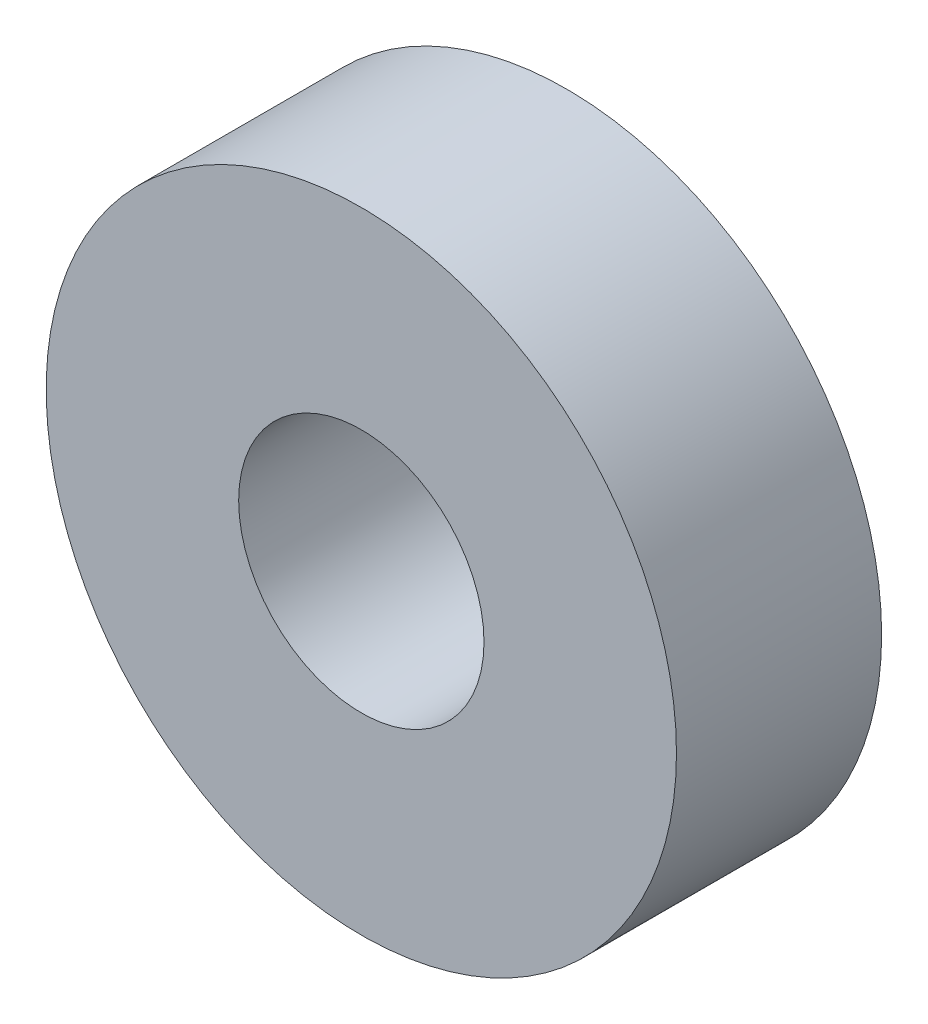
ISO-10303-21;
HEADER;
FILE_DESCRIPTION(('STEP AP214'),'2;1');
FILE_NAME('part.step','',(''),(''),'','','');
FILE_SCHEMA(('AUTOMOTIVE_DESIGN { 1 0 10303 214 1 1 1 1 }'));
ENDSEC;
DATA;
#1=APPLICATION_CONTEXT('core data for automotive mechanical design processes');
#2=APPLICATION_PROTOCOL_DEFINITION('international standard','automotive_design',2000,#1);
#3=PRODUCT_CONTEXT('',#1,'mechanical');
#4=PRODUCT('Part','Part','',(#3));
#5=PRODUCT_RELATED_PRODUCT_CATEGORY('part','',(#4));
#6=PRODUCT_DEFINITION_FORMATION('','',#4);
#7=PRODUCT_DEFINITION_CONTEXT('part definition',#1,'design');
#8=PRODUCT_DEFINITION('design','',#6,#7);
#9=PRODUCT_DEFINITION_SHAPE('','',#8);
#10=(LENGTH_UNIT() NAMED_UNIT(*) SI_UNIT(.MILLI.,.METRE.));
#11=(NAMED_UNIT(*) PLANE_ANGLE_UNIT() SI_UNIT($,.RADIAN.));
#12=(NAMED_UNIT(*) SI_UNIT($,.STERADIAN.) SOLID_ANGLE_UNIT());
#13=UNCERTAINTY_MEASURE_WITH_UNIT(LENGTH_MEASURE(1.E-05),#10,'distance_accuracy_value','');
#14=(GEOMETRIC_REPRESENTATION_CONTEXT(3) GLOBAL_UNCERTAINTY_ASSIGNED_CONTEXT((#13)) GLOBAL_UNIT_ASSIGNED_CONTEXT((#10,
#11,#12)) REPRESENTATION_CONTEXT('',''));
#15=CARTESIAN_POINT('',(0.,0.,0.));
#16=DIRECTION('',(0.,0.,1.));
#17=DIRECTION('',(1.,0.,0.));
#18=AXIS2_PLACEMENT_3D('',#15,#16,#17);
#19=CARTESIAN_POINT('',(0.,0.,4.85));
#20=DIRECTION('',(0.,0.,1.));
#21=DIRECTION('',(1.,0.,0.));
#22=AXIS2_PLACEMENT_3D('',#19,#20,#21);
#23=PLANE('',#22);
#24=CARTESIAN_POINT('',(0.,0.,4.85));
#25=DIRECTION('',(0.,0.,1.));
#26=DIRECTION('',(1.,0.,0.));
#27=AXIS2_PLACEMENT_3D('',#24,#25,#26);
#28=CIRCLE('',#27,7.45);
#29=CARTESIAN_POINT('',(7.45,0.,4.85));
#30=VERTEX_POINT('',#29);
#31=EDGE_CURVE('E10',#30,#30,#28,.T.);
#32=ORIENTED_EDGE('',*,*,#31,.T.);
#33=EDGE_LOOP('',(#32));
#34=FACE_BOUND('',#33,.T.);
#35=CARTESIAN_POINT('',(0.,0.,4.85));
#36=DIRECTION('',(0.,0.,1.));
#37=DIRECTION('',(1.,0.,0.));
#38=AXIS2_PLACEMENT_3D('',#35,#36,#37);
#39=CIRCLE('',#38,2.9);
#40=CARTESIAN_POINT('',(2.9,0.,4.85));
#41=VERTEX_POINT('',#40);
#42=EDGE_CURVE('E42',#41,#41,#39,.T.);
#43=ORIENTED_EDGE('',*,*,#42,.F.);
#44=EDGE_LOOP('',(#43));
#45=FACE_BOUND('',#44,.T.);
#46=ADVANCED_FACE('F31',(#34,#45),#23,.T.);
#47=CARTESIAN_POINT('',(0.,0.,0.));
#48=DIRECTION('',(0.,0.,1.));
#49=DIRECTION('',(1.,0.,0.));
#50=AXIS2_PLACEMENT_3D('',#47,#48,#49);
#51=PLANE('',#50);
#52=CARTESIAN_POINT('',(0.,0.,0.));
#53=DIRECTION('',(0.,0.,1.));
#54=DIRECTION('',(1.,0.,0.));
#55=AXIS2_PLACEMENT_3D('',#52,#53,#54);
#56=CIRCLE('',#55,7.45);
#57=CARTESIAN_POINT('',(7.45,0.,0.));
#58=VERTEX_POINT('',#57);
#59=EDGE_CURVE('E35',#58,#58,#56,.T.);
#60=ORIENTED_EDGE('',*,*,#59,.F.);
#61=EDGE_LOOP('',(#60));
#62=FACE_BOUND('',#61,.T.);
#63=CARTESIAN_POINT('',(0.,0.,0.));
#64=DIRECTION('',(0.,0.,1.));
#65=DIRECTION('',(1.,0.,0.));
#66=AXIS2_PLACEMENT_3D('',#63,#64,#65);
#67=CIRCLE('',#66,2.9);
#68=CARTESIAN_POINT('',(2.9,0.,0.));
#69=VERTEX_POINT('',#68);
#70=EDGE_CURVE('E44',#69,#69,#67,.T.);
#71=ORIENTED_EDGE('',*,*,#70,.T.);
#72=EDGE_LOOP('',(#71));
#73=FACE_BOUND('',#72,.T.);
#74=ADVANCED_FACE('F54',(#62,#73),#51,.F.);
#75=CARTESIAN_POINT('',(0.,0.,4.85));
#76=DIRECTION('',(0.,0.,-1.));
#77=DIRECTION('',(-1.,0.,0.));
#78=AXIS2_PLACEMENT_3D('',#75,#76,#77);
#79=CYLINDRICAL_SURFACE('',#78,7.45);
#80=ORIENTED_EDGE('',*,*,#31,.F.);
#81=EDGE_LOOP('',(#80));
#82=FACE_BOUND('',#81,.T.);
#83=ORIENTED_EDGE('',*,*,#59,.T.);
#84=EDGE_LOOP('',(#83));
#85=FACE_BOUND('',#84,.T.);
#86=ADVANCED_FACE('F33',(#82,#85),#79,.T.);
#87=CARTESIAN_POINT('',(0.,0.,4.85));
#88=DIRECTION('',(0.,0.,-1.));
#89=DIRECTION('',(-1.,0.,0.));
#90=AXIS2_PLACEMENT_3D('',#87,#88,#89);
#91=CYLINDRICAL_SURFACE('',#90,2.9);
#92=ORIENTED_EDGE('',*,*,#42,.T.);
#93=EDGE_LOOP('',(#92));
#94=FACE_BOUND('',#93,.T.);
#95=ORIENTED_EDGE('',*,*,#70,.F.);
#96=EDGE_LOOP('',(#95));
#97=FACE_BOUND('',#96,.T.);
#98=ADVANCED_FACE('F50',(#94,#97),#91,.F.);
#99=CLOSED_SHELL('',(#46,#74,#86,#98));
#100=MANIFOLD_SOLID_BREP('B2',#99);
#101=ADVANCED_BREP_SHAPE_REPRESENTATION('',(#18,#100),#14);
#102=SHAPE_DEFINITION_REPRESENTATION(#9,#101);
ENDSEC;
END-ISO-10303-21;
